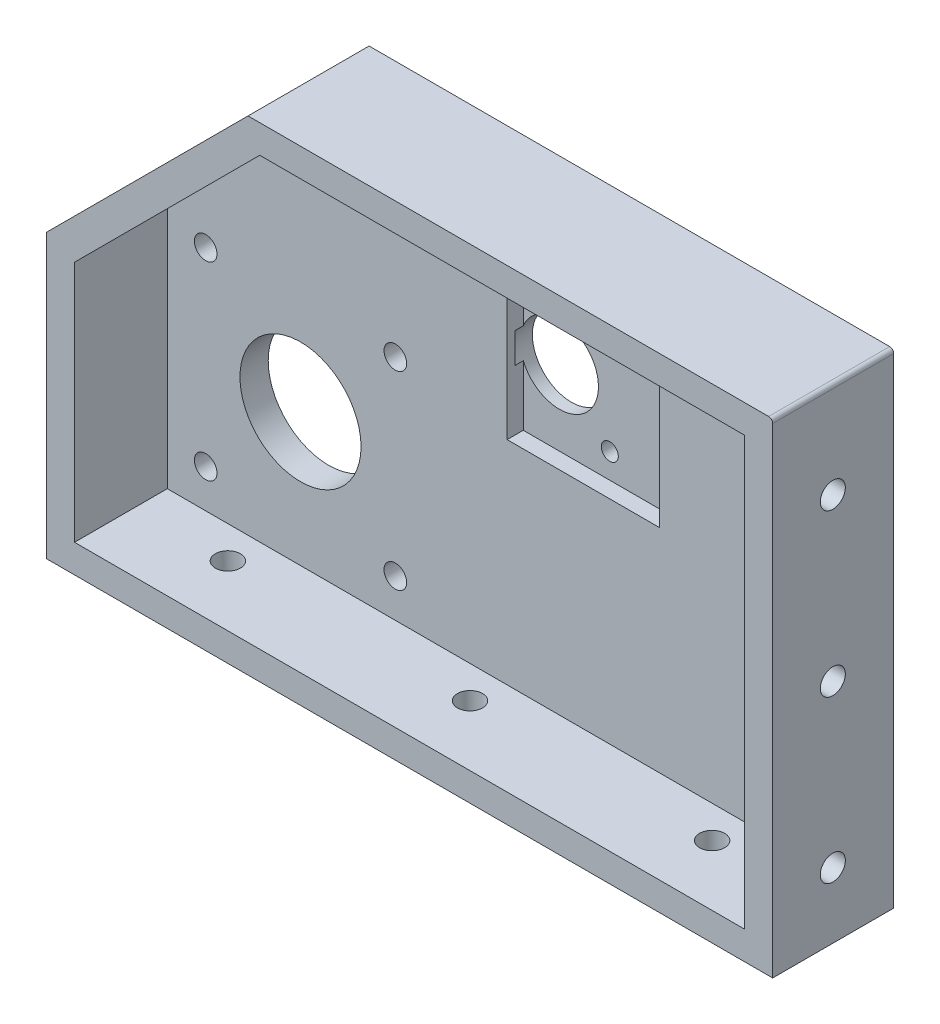
ISO-10303-21;
HEADER;
FILE_DESCRIPTION(('STEP AP214'),'2;1');
FILE_NAME('part.step','',(''),(''),'','','');
FILE_SCHEMA(('AUTOMOTIVE_DESIGN { 1 0 10303 214 1 1 1 1 }'));
ENDSEC;
DATA;
#1=APPLICATION_CONTEXT('core data for automotive mechanical design processes');
#2=APPLICATION_PROTOCOL_DEFINITION('international standard','automotive_design',2000,#1);
#3=PRODUCT_CONTEXT('',#1,'mechanical');
#4=PRODUCT('Part','Part','',(#3));
#5=PRODUCT_RELATED_PRODUCT_CATEGORY('part','',(#4));
#6=PRODUCT_DEFINITION_FORMATION('','',#4);
#7=PRODUCT_DEFINITION_CONTEXT('part definition',#1,'design');
#8=PRODUCT_DEFINITION('design','',#6,#7);
#9=PRODUCT_DEFINITION_SHAPE('','',#8);
#10=(LENGTH_UNIT() NAMED_UNIT(*) SI_UNIT(.MILLI.,.METRE.));
#11=(NAMED_UNIT(*) PLANE_ANGLE_UNIT() SI_UNIT($,.RADIAN.));
#12=(NAMED_UNIT(*) SI_UNIT($,.STERADIAN.) SOLID_ANGLE_UNIT());
#13=UNCERTAINTY_MEASURE_WITH_UNIT(LENGTH_MEASURE(1.E-05),#10,'distance_accuracy_value','');
#14=(GEOMETRIC_REPRESENTATION_CONTEXT(3) GLOBAL_UNCERTAINTY_ASSIGNED_CONTEXT((#13)) GLOBAL_UNIT_ASSIGNED_CONTEXT((#10,
#11,#12)) REPRESENTATION_CONTEXT('',''));
#15=CARTESIAN_POINT('',(0.,0.,0.));
#16=DIRECTION('',(0.,0.,1.));
#17=DIRECTION('',(1.,0.,0.));
#18=AXIS2_PLACEMENT_3D('',#15,#16,#17);
#19=CARTESIAN_POINT('',(71.4200962832074,47.0255117384244,15.0989873182288));
#20=DIRECTION('',(1.,0.,0.));
#21=DIRECTION('',(0.,1.,0.));
#22=AXIS2_PLACEMENT_3D('',#19,#20,#21);
#23=CYLINDRICAL_SURFACE('',#22,3.10668824193389);
#24=CARTESIAN_POINT('',(74.4200962832074,47.0255117384244,15.0989873182288));
#25=DIRECTION('',(-1.,0.,0.));
#26=DIRECTION('',(0.,-1.,0.));
#27=AXIS2_PLACEMENT_3D('',#24,#25,#26);
#28=CIRCLE('',#27,3.10668824193389);
#29=CARTESIAN_POINT('',(74.4200962832074,43.9188234964905,15.0989873182288));
#30=VERTEX_POINT('',#29);
#31=EDGE_CURVE('E42',#30,#30,#28,.T.);
#32=ORIENTED_EDGE('',*,*,#31,.T.);
#33=EDGE_LOOP('',(#32));
#34=FACE_BOUND('',#33,.T.);
#35=CARTESIAN_POINT('',(81.4200962832074,47.0255117384244,15.0989873182288));
#36=DIRECTION('',(1.,0.,0.));
#37=DIRECTION('',(0.,1.,0.));
#38=AXIS2_PLACEMENT_3D('',#35,#36,#37);
#39=CIRCLE('',#38,3.10668824193389);
#40=CARTESIAN_POINT('',(81.4200962832074,50.1321999803583,15.0989873182288));
#41=VERTEX_POINT('',#40);
#42=EDGE_CURVE('E11',#41,#41,#39,.T.);
#43=ORIENTED_EDGE('',*,*,#42,.T.);
#44=EDGE_LOOP('',(#43));
#45=FACE_BOUND('',#44,.T.);
#46=ADVANCED_FACE('F35',(#34,#45),#23,.F.);
#47=CARTESIAN_POINT('',(51.4200962832074,-39.2220936044638,15.));
#48=DIRECTION('',(0.,-1.,0.));
#49=DIRECTION('',(0.,0.,-1.));
#50=AXIS2_PLACEMENT_3D('',#47,#48,#49);
#51=CYLINDRICAL_SURFACE('',#50,3.09997711784959);
#52=CARTESIAN_POINT('',(51.4200962832074,-42.2220936044638,15.));
#53=DIRECTION('',(0.,1.,0.));
#54=DIRECTION('',(0.,0.,1.));
#55=AXIS2_PLACEMENT_3D('',#52,#53,#54);
#56=CIRCLE('',#55,3.09997711784959);
#57=CARTESIAN_POINT('',(51.4200962832074,-42.2220936044638,18.0999771178496));
#58=VERTEX_POINT('',#57);
#59=EDGE_CURVE('E169',#58,#58,#56,.T.);
#60=ORIENTED_EDGE('',*,*,#59,.T.);
#61=EDGE_LOOP('',(#60));
#62=FACE_BOUND('',#61,.T.);
#63=CARTESIAN_POINT('',(51.4200962832074,-49.2220936044638,15.));
#64=DIRECTION('',(0.,-1.,0.));
#65=DIRECTION('',(0.,0.,-1.));
#66=AXIS2_PLACEMENT_3D('',#63,#64,#65);
#67=CIRCLE('',#66,3.09997711784959);
#68=CARTESIAN_POINT('',(51.4200962832074,-49.2220936044638,11.9000228821504));
#69=VERTEX_POINT('',#68);
#70=EDGE_CURVE('E172',#69,#69,#67,.T.);
#71=ORIENTED_EDGE('',*,*,#70,.T.);
#72=EDGE_LOOP('',(#71));
#73=FACE_BOUND('',#72,.T.);
#74=ADVANCED_FACE('F228',(#62,#73),#51,.F.);
#75=CARTESIAN_POINT('',(-7.37865034544528,48.7779063955362,3.));
#76=DIRECTION('',(-1.,0.,0.));
#77=DIRECTION('',(0.,-1.,0.));
#78=AXIS2_PLACEMENT_3D('',#75,#76,#77);
#79=PLANE('',#78);
#80=DIRECTION('',(0.,0.,1.));
#81=VECTOR('',#80,1.);
#82=CARTESIAN_POINT('',(-7.37865034544528,25.3468501877261,-5.));
#83=LINE('',#82,#81);
#84=CARTESIAN_POINT('',(-7.37865034544528,25.3468501877261,5.));
#85=VERTEX_POINT('',#84);
#86=CARTESIAN_POINT('',(-7.37865034544528,25.3468501877261,3.));
#87=VERTEX_POINT('',#86);
#88=EDGE_CURVE('E49',#85,#87,#83,.F.);
#89=ORIENTED_EDGE('',*,*,#88,.F.);
#90=DIRECTION('',(0.,-1.,0.));
#91=VECTOR('',#90,1.);
#92=CARTESIAN_POINT('',(-7.37865034544528,48.7779063955362,5.));
#93=LINE('',#92,#91);
#94=CARTESIAN_POINT('',(-7.37865034544528,32.8287690495323,5.));
#95=VERTEX_POINT('',#94);
#96=EDGE_CURVE('E164',#95,#85,#93,.T.);
#97=ORIENTED_EDGE('',*,*,#96,.F.);
#98=DIRECTION('',(0.,0.,1.));
#99=VECTOR('',#98,1.);
#100=CARTESIAN_POINT('',(-7.37865034544528,32.8287690495323,-5.));
#101=LINE('',#100,#99);
#102=CARTESIAN_POINT('',(-7.37865034544528,32.8287690495323,3.));
#103=VERTEX_POINT('',#102);
#104=EDGE_CURVE('E153',#103,#95,#101,.T.);
#105=ORIENTED_EDGE('',*,*,#104,.F.);
#106=DIRECTION('',(0.,-1.,0.));
#107=VECTOR('',#106,1.);
#108=CARTESIAN_POINT('',(-7.37865034544528,48.7779063955362,3.));
#109=LINE('',#108,#107);
#110=CARTESIAN_POINT('',(-7.37865034544528,48.7779063955362,3.));
#111=VERTEX_POINT('',#110);
#112=EDGE_CURVE('E482',#111,#103,#109,.T.);
#113=ORIENTED_EDGE('',*,*,#112,.F.);
#114=DIRECTION('',(0.,0.,1.));
#115=VECTOR('',#114,1.);
#116=CARTESIAN_POINT('',(-7.37865034544528,48.7779063955362,3.));
#117=LINE('',#116,#115);
#118=CARTESIAN_POINT('',(-7.37865034544528,48.7779063955362,7.));
#119=VERTEX_POINT('',#118);
#120=EDGE_CURVE('E453',#111,#119,#117,.T.);
#121=ORIENTED_EDGE('',*,*,#120,.T.);
#122=DIRECTION('',(0.,-1.,0.));
#123=VECTOR('',#122,1.);
#124=CARTESIAN_POINT('',(-7.37865034544528,48.7779063955362,7.));
#125=LINE('',#124,#123);
#126=CARTESIAN_POINT('',(-7.37865034544527,10.4125304842075,7.));
#127=VERTEX_POINT('',#126);
#128=EDGE_CURVE('E57',#119,#127,#125,.T.);
#129=ORIENTED_EDGE('',*,*,#128,.T.);
#130=DIRECTION('',(0.,0.,1.));
#131=VECTOR('',#130,1.);
#132=CARTESIAN_POINT('',(-7.37865034544527,10.4125304842075,3.));
#133=LINE('',#132,#131);
#134=CARTESIAN_POINT('',(-7.37865034544527,10.4125304842075,3.));
#135=VERTEX_POINT('',#134);
#136=EDGE_CURVE('E454',#135,#127,#133,.T.);
#137=ORIENTED_EDGE('',*,*,#136,.F.);
#138=EDGE_CURVE('E465',#87,#135,#109,.T.);
#139=ORIENTED_EDGE('',*,*,#138,.F.);
#140=EDGE_LOOP('',(#89,#97,#105,#113,#121,#129,#137,#139));
#141=FACE_BOUND('',#140,.T.);
#142=ADVANCED_FACE('F167',(#141),#79,.F.);
#143=CARTESIAN_POINT('',(-35.0799037167926,-32.7220936044638,-13.));
#144=DIRECTION('',(0.,0.,1.));
#145=DIRECTION('',(1.,0.,0.));
#146=AXIS2_PLACEMENT_3D('',#143,#144,#145);
#147=CYLINDRICAL_SURFACE('',#146,2.80599900368879);
#148=CARTESIAN_POINT('',(-35.0799037167926,-32.7220936044638,0.));
#149=DIRECTION('',(0.,0.,-1.));
#150=DIRECTION('',(-1.,0.,0.));
#151=AXIS2_PLACEMENT_3D('',#148,#149,#150);
#152=CIRCLE('',#151,2.80599900368879);
#153=CARTESIAN_POINT('',(-37.8859027204814,-32.7220936044638,0.));
#154=VERTEX_POINT('',#153);
#155=EDGE_CURVE('E379',#154,#154,#152,.T.);
#156=ORIENTED_EDGE('',*,*,#155,.T.);
#157=EDGE_LOOP('',(#156));
#158=FACE_BOUND('',#157,.T.);
#159=CARTESIAN_POINT('',(-35.0799037167926,-32.7220936044638,7.));
#160=DIRECTION('',(0.,0.,1.));
#161=DIRECTION('',(1.,0.,0.));
#162=AXIS2_PLACEMENT_3D('',#159,#160,#161);
#163=CIRCLE('',#162,2.80599900368879);
#164=CARTESIAN_POINT('',(-32.2739047131038,-32.7220936044638,7.));
#165=VERTEX_POINT('',#164);
#166=EDGE_CURVE('E174',#165,#165,#163,.T.);
#167=ORIENTED_EDGE('',*,*,#166,.T.);
#168=EDGE_LOOP('',(#167));
#169=FACE_BOUND('',#168,.T.);
#170=ADVANCED_FACE('F236',(#158,#169),#147,.F.);
#171=CARTESIAN_POINT('',(-82.0799037167926,-32.7220936044638,-13.));
#172=DIRECTION('',(0.,0.,1.));
#173=DIRECTION('',(1.,0.,0.));
#174=AXIS2_PLACEMENT_3D('',#171,#172,#173);
#175=CYLINDRICAL_SURFACE('',#174,2.80599900368879);
#176=CARTESIAN_POINT('',(-82.0799037167926,-32.7220936044638,0.));
#177=DIRECTION('',(0.,0.,-1.));
#178=DIRECTION('',(-1.,0.,0.));
#179=AXIS2_PLACEMENT_3D('',#176,#177,#178);
#180=CIRCLE('',#179,2.80599900368879);
#181=CARTESIAN_POINT('',(-84.8859027204814,-32.7220936044638,0.));
#182=VERTEX_POINT('',#181);
#183=EDGE_CURVE('E373',#182,#182,#180,.T.);
#184=ORIENTED_EDGE('',*,*,#183,.T.);
#185=EDGE_LOOP('',(#184));
#186=FACE_BOUND('',#185,.T.);
#187=CARTESIAN_POINT('',(-82.0799037167926,-32.7220936044638,7.));
#188=DIRECTION('',(0.,0.,1.));
#189=DIRECTION('',(1.,0.,0.));
#190=AXIS2_PLACEMENT_3D('',#187,#188,#189);
#191=CIRCLE('',#190,2.80599900368879);
#192=CARTESIAN_POINT('',(-79.2739047131038,-32.7220936044638,7.));
#193=VERTEX_POINT('',#192);
#194=EDGE_CURVE('E376',#193,#193,#191,.T.);
#195=ORIENTED_EDGE('',*,*,#194,.T.);
#196=EDGE_LOOP('',(#195));
#197=FACE_BOUND('',#196,.T.);
#198=ADVANCED_FACE('F242',(#186,#197),#175,.F.);
#199=CARTESIAN_POINT('',(80.4200962832074,69.7779063955362,30.));
#200=DIRECTION('',(0.,0.,-1.));
#201=DIRECTION('',(-1.,0.,0.));
#202=AXIS2_PLACEMENT_3D('',#199,#200,#201);
#203=PLANE('',#202);
#204=DIRECTION('',(0.,1.,0.));
#205=VECTOR('',#204,1.);
#206=CARTESIAN_POINT('',(81.4200962832074,69.7779063955362,30.));
#207=LINE('',#206,#205);
#208=CARTESIAN_POINT('',(81.4200962832074,-49.2220936044638,30.));
#209=VERTEX_POINT('',#208);
#210=CARTESIAN_POINT('',(81.4200962832074,69.7779063955362,30.));
#211=VERTEX_POINT('',#210);
#212=EDGE_CURVE('E328',#209,#211,#207,.T.);
#213=ORIENTED_EDGE('',*,*,#212,.T.);
#214=CARTESIAN_POINT('',(80.4200962832074,69.7779063955362,30.));
#215=DIRECTION('',(0.,0.,1.));
#216=DIRECTION('',(-1.,0.,0.));
#217=AXIS2_PLACEMENT_3D('',#214,#215,#216);
#218=CIRCLE('',#217,1.00000000000001);
#219=CARTESIAN_POINT('',(80.4200962832074,70.7779063955362,30.));
#220=VERTEX_POINT('',#219);
#221=EDGE_CURVE('E331',#211,#220,#218,.T.);
#222=ORIENTED_EDGE('',*,*,#221,.T.);
#223=DIRECTION('',(-1.,0.,0.));
#224=VECTOR('',#223,1.);
#225=CARTESIAN_POINT('',(-48.5799037167926,70.7779063955362,30.));
#226=LINE('',#225,#224);
#227=CARTESIAN_POINT('',(-48.5799037167926,70.7779063955362,30.));
#228=VERTEX_POINT('',#227);
#229=EDGE_CURVE('E334',#220,#228,#226,.T.);
#230=ORIENTED_EDGE('',*,*,#229,.T.);
#231=DIRECTION('',(-0.707106781186547,-0.707106781186547,0.));
#232=VECTOR('',#231,1.);
#233=CARTESIAN_POINT('',(-48.5799037167926,70.7779063955362,30.));
#234=LINE('',#233,#232);
#235=CARTESIAN_POINT('',(-98.5799037167926,20.7779063955362,30.));
#236=VERTEX_POINT('',#235);
#237=EDGE_CURVE('E336',#228,#236,#234,.T.);
#238=ORIENTED_EDGE('',*,*,#237,.T.);
#239=DIRECTION('',(0.,-1.,0.));
#240=VECTOR('',#239,1.);
#241=CARTESIAN_POINT('',(-98.5799037167926,20.7779063955362,30.));
#242=LINE('',#241,#240);
#243=CARTESIAN_POINT('',(-98.5799037167926,-49.2220936044638,30.));
#244=VERTEX_POINT('',#243);
#245=EDGE_CURVE('E338',#236,#244,#242,.T.);
#246=ORIENTED_EDGE('',*,*,#245,.T.);
#247=DIRECTION('',(1.,0.,0.));
#248=VECTOR('',#247,1.);
#249=CARTESIAN_POINT('',(-98.5799037167926,-49.2220936044638,30.));
#250=LINE('',#249,#248);
#251=EDGE_CURVE('E340',#244,#209,#250,.T.);
#252=ORIENTED_EDGE('',*,*,#251,.T.);
#253=EDGE_LOOP('',(#213,#222,#230,#238,#246,#252));
#254=FACE_BOUND('',#253,.T.);
#255=DIRECTION('',(0.,1.,0.));
#256=VECTOR('',#255,1.);
#257=CARTESIAN_POINT('',(74.4200962832074,69.7779063955362,30.));
#258=LINE('',#257,#256);
#259=CARTESIAN_POINT('',(74.4200962832074,-42.2220936044638,30.));
#260=VERTEX_POINT('',#259);
#261=CARTESIAN_POINT('',(74.4200962832074,63.7779063955362,30.));
#262=VERTEX_POINT('',#261);
#263=EDGE_CURVE('E317',#260,#262,#258,.T.);
#264=ORIENTED_EDGE('',*,*,#263,.F.);
#265=DIRECTION('',(1.,0.,0.));
#266=VECTOR('',#265,1.);
#267=CARTESIAN_POINT('',(80.4200962832074,-42.2220936044638,30.));
#268=LINE('',#267,#266);
#269=CARTESIAN_POINT('',(-91.5799037167926,-42.2220936044638,30.));
#270=VERTEX_POINT('',#269);
#271=EDGE_CURVE('E326',#270,#260,#268,.T.);
#272=ORIENTED_EDGE('',*,*,#271,.F.);
#273=DIRECTION('',(0.,-1.,0.));
#274=VECTOR('',#273,1.);
#275=CARTESIAN_POINT('',(-91.5799037167926,69.7779063955362,30.));
#276=LINE('',#275,#274);
#277=CARTESIAN_POINT('',(-91.5799037167926,17.8784114589246,30.));
#278=VERTEX_POINT('',#277);
#279=EDGE_CURVE('E323',#278,#270,#276,.T.);
#280=ORIENTED_EDGE('',*,*,#279,.F.);
#281=DIRECTION('',(-0.707106781186548,-0.707106781186548,0.));
#282=VECTOR('',#281,1.);
#283=CARTESIAN_POINT('',(20.3698437515132,129.82815892723,30.));
#284=LINE('',#283,#282);
#285=CARTESIAN_POINT('',(-45.680408780181,63.7779063955362,30.));
#286=VERTEX_POINT('',#285);
#287=EDGE_CURVE('E321',#286,#278,#284,.T.);
#288=ORIENTED_EDGE('',*,*,#287,.F.);
#289=DIRECTION('',(-1.,0.,0.));
#290=VECTOR('',#289,1.);
#291=CARTESIAN_POINT('',(80.4200962832074,63.7779063955362,30.));
#292=LINE('',#291,#290);
#293=EDGE_CURVE('E319',#262,#286,#292,.T.);
#294=ORIENTED_EDGE('',*,*,#293,.F.);
#295=EDGE_LOOP('',(#264,#272,#280,#288,#294));
#296=FACE_BOUND('',#295,.T.);
#297=ADVANCED_FACE('F246',(#254,#296),#203,.F.);
#298=CARTESIAN_POINT('',(81.4200962832074,69.7779063955362,30.));
#299=DIRECTION('',(-1.,0.,0.));
#300=DIRECTION('',(0.,-1.,0.));
#301=AXIS2_PLACEMENT_3D('',#298,#299,#300);
#302=PLANE('',#301);
#303=CARTESIAN_POINT('',(81.4200962832074,7.02551173842437,15.0989873182288));
#304=DIRECTION('',(1.,0.,0.));
#305=DIRECTION('',(0.,1.,0.));
#306=AXIS2_PLACEMENT_3D('',#303,#304,#305);
#307=CIRCLE('',#306,3.10668824193389);
#308=CARTESIAN_POINT('',(81.4200962832074,10.1321999803583,15.0989873182288));
#309=VERTEX_POINT('',#308);
#310=EDGE_CURVE('E504',#309,#309,#307,.T.);
#311=ORIENTED_EDGE('',*,*,#310,.F.);
#312=EDGE_LOOP('',(#311));
#313=FACE_BOUND('',#312,.T.);
#314=CARTESIAN_POINT('',(81.4200962832074,-32.9744882615756,15.0989873182288));
#315=DIRECTION('',(1.,0.,0.));
#316=DIRECTION('',(0.,1.,0.));
#317=AXIS2_PLACEMENT_3D('',#314,#315,#316);
#318=CIRCLE('',#317,3.10668824193389);
#319=CARTESIAN_POINT('',(81.4200962832074,-29.8678000196417,15.0989873182288));
#320=VERTEX_POINT('',#319);
#321=EDGE_CURVE('E202',#320,#320,#318,.T.);
#322=ORIENTED_EDGE('',*,*,#321,.F.);
#323=EDGE_LOOP('',(#322));
#324=FACE_BOUND('',#323,.T.);
#325=DIRECTION('',(0.,1.,0.));
#326=VECTOR('',#325,1.);
#327=CARTESIAN_POINT('',(81.4200962832074,69.7779063955362,0.));
#328=LINE('',#327,#326);
#329=CARTESIAN_POINT('',(81.4200962832074,-49.2220936044638,0.));
#330=VERTEX_POINT('',#329);
#331=CARTESIAN_POINT('',(81.4200962832074,69.7779063955362,0.));
#332=VERTEX_POINT('',#331);
#333=EDGE_CURVE('E343',#330,#332,#328,.T.);
#334=ORIENTED_EDGE('',*,*,#333,.T.);
#335=DIRECTION('',(0.,0.,-1.));
#336=VECTOR('',#335,1.);
#337=CARTESIAN_POINT('',(81.4200962832074,69.7779063955362,30.));
#338=LINE('',#337,#336);
#339=EDGE_CURVE('E370',#211,#332,#338,.T.);
#340=ORIENTED_EDGE('',*,*,#339,.F.);
#341=ORIENTED_EDGE('',*,*,#212,.F.);
#342=DIRECTION('',(0.,0.,-1.));
#343=VECTOR('',#342,1.);
#344=CARTESIAN_POINT('',(81.4200962832074,-49.2220936044638,30.));
#345=LINE('',#344,#343);
#346=EDGE_CURVE('E342',#209,#330,#345,.T.);
#347=ORIENTED_EDGE('',*,*,#346,.T.);
#348=EDGE_LOOP('',(#334,#340,#341,#347));
#349=FACE_BOUND('',#348,.T.);
#350=ORIENTED_EDGE('',*,*,#42,.F.);
#351=EDGE_LOOP('',(#350));
#352=FACE_BOUND('',#351,.T.);
#353=ADVANCED_FACE('F248',(#313,#324,#349,#352),#302,.F.);
#354=CARTESIAN_POINT('',(80.4200962832074,69.7779063955362,30.));
#355=DIRECTION('',(0.,0.,-1.));
#356=DIRECTION('',(-1.,0.,0.));
#357=AXIS2_PLACEMENT_3D('',#354,#355,#356);
#358=CYLINDRICAL_SURFACE('',#357,1.00000000000001);
#359=CARTESIAN_POINT('',(80.4200962832074,69.7779063955362,0.));
#360=DIRECTION('',(0.,0.,1.));
#361=DIRECTION('',(-1.,0.,0.));
#362=AXIS2_PLACEMENT_3D('',#359,#360,#361);
#363=CIRCLE('',#362,1.00000000000001);
#364=CARTESIAN_POINT('',(80.4200962832074,70.7779063955362,0.));
#365=VERTEX_POINT('',#364);
#366=EDGE_CURVE('E346',#332,#365,#363,.T.);
#367=ORIENTED_EDGE('',*,*,#366,.T.);
#368=DIRECTION('',(0.,0.,-1.));
#369=VECTOR('',#368,1.);
#370=CARTESIAN_POINT('',(80.4200962832074,70.7779063955362,30.));
#371=LINE('',#370,#369);
#372=EDGE_CURVE('E367',#220,#365,#371,.T.);
#373=ORIENTED_EDGE('',*,*,#372,.F.);
#374=ORIENTED_EDGE('',*,*,#221,.F.);
#375=ORIENTED_EDGE('',*,*,#339,.T.);
#376=EDGE_LOOP('',(#367,#373,#374,#375));
#377=FACE_BOUND('',#376,.T.);
#378=ADVANCED_FACE('F251',(#377),#358,.T.);
#379=CARTESIAN_POINT('',(-48.5799037167926,70.7779063955362,30.));
#380=DIRECTION('',(0.,-1.,0.));
#381=DIRECTION('',(1.,0.,0.));
#382=AXIS2_PLACEMENT_3D('',#379,#380,#381);
#383=PLANE('',#382);
#384=DIRECTION('',(-1.,0.,0.));
#385=VECTOR('',#384,1.);
#386=CARTESIAN_POINT('',(-48.5799037167926,70.7779063955362,0.));
#387=LINE('',#386,#385);
#388=CARTESIAN_POINT('',(-48.5799037167926,70.7779063955362,0.));
#389=VERTEX_POINT('',#388);
#390=EDGE_CURVE('E349',#365,#389,#387,.T.);
#391=ORIENTED_EDGE('',*,*,#390,.T.);
#392=DIRECTION('',(0.,0.,-1.));
#393=VECTOR('',#392,1.);
#394=CARTESIAN_POINT('',(-48.5799037167926,70.7779063955362,30.));
#395=LINE('',#394,#393);
#396=EDGE_CURVE('E364',#228,#389,#395,.T.);
#397=ORIENTED_EDGE('',*,*,#396,.F.);
#398=ORIENTED_EDGE('',*,*,#229,.F.);
#399=ORIENTED_EDGE('',*,*,#372,.T.);
#400=EDGE_LOOP('',(#391,#397,#398,#399));
#401=FACE_BOUND('',#400,.T.);
#402=ADVANCED_FACE('F255',(#401),#383,.F.);
#403=CARTESIAN_POINT('',(-48.5799037167926,70.7779063955362,30.));
#404=DIRECTION('',(0.707106781186547,-0.707106781186547,0.));
#405=DIRECTION('',(0.707106781186548,0.707106781186548,0.));
#406=AXIS2_PLACEMENT_3D('',#403,#404,#405);
#407=PLANE('',#406);
#408=DIRECTION('',(-0.707106781186547,-0.707106781186547,0.));
#409=VECTOR('',#408,1.);
#410=CARTESIAN_POINT('',(-48.5799037167926,70.7779063955362,0.));
#411=LINE('',#410,#409);
#412=CARTESIAN_POINT('',(-98.5799037167926,20.7779063955362,0.));
#413=VERTEX_POINT('',#412);
#414=EDGE_CURVE('E351',#389,#413,#411,.T.);
#415=ORIENTED_EDGE('',*,*,#414,.T.);
#416=DIRECTION('',(0.,0.,-1.));
#417=VECTOR('',#416,1.);
#418=CARTESIAN_POINT('',(-98.5799037167926,20.7779063955362,30.));
#419=LINE('',#418,#417);
#420=EDGE_CURVE('E361',#236,#413,#419,.T.);
#421=ORIENTED_EDGE('',*,*,#420,.F.);
#422=ORIENTED_EDGE('',*,*,#237,.F.);
#423=ORIENTED_EDGE('',*,*,#396,.T.);
#424=EDGE_LOOP('',(#415,#421,#422,#423));
#425=FACE_BOUND('',#424,.T.);
#426=ADVANCED_FACE('F259',(#425),#407,.F.);
#427=CARTESIAN_POINT('',(-98.5799037167926,20.7779063955362,30.));
#428=DIRECTION('',(1.,0.,0.));
#429=DIRECTION('',(0.,0.,-1.));
#430=AXIS2_PLACEMENT_3D('',#427,#428,#429);
#431=PLANE('',#430);
#432=DIRECTION('',(0.,-1.,0.));
#433=VECTOR('',#432,1.);
#434=CARTESIAN_POINT('',(-98.5799037167926,20.7779063955362,0.));
#435=LINE('',#434,#433);
#436=CARTESIAN_POINT('',(-98.5799037167926,-49.2220936044638,0.));
#437=VERTEX_POINT('',#436);
#438=EDGE_CURVE('E353',#413,#437,#435,.T.);
#439=ORIENTED_EDGE('',*,*,#438,.T.);
#440=DIRECTION('',(0.,0.,-1.));
#441=VECTOR('',#440,1.);
#442=CARTESIAN_POINT('',(-98.5799037167926,-49.2220936044638,30.));
#443=LINE('',#442,#441);
#444=EDGE_CURVE('E358',#244,#437,#443,.T.);
#445=ORIENTED_EDGE('',*,*,#444,.F.);
#446=ORIENTED_EDGE('',*,*,#245,.F.);
#447=ORIENTED_EDGE('',*,*,#420,.T.);
#448=EDGE_LOOP('',(#439,#445,#446,#447));
#449=FACE_BOUND('',#448,.T.);
#450=ADVANCED_FACE('F263',(#449),#431,.F.);
#451=CARTESIAN_POINT('',(-98.5799037167926,-49.2220936044638,30.));
#452=DIRECTION('',(0.,1.,0.));
#453=DIRECTION('',(0.,0.,1.));
#454=AXIS2_PLACEMENT_3D('',#451,#452,#453);
#455=PLANE('',#454);
#456=CARTESIAN_POINT('',(-8.57990371679264,-49.2220936044638,15.));
#457=DIRECTION('',(0.,-1.,0.));
#458=DIRECTION('',(0.,0.,-1.));
#459=AXIS2_PLACEMENT_3D('',#456,#457,#458);
#460=CIRCLE('',#459,3.09997711784959);
#461=CARTESIAN_POINT('',(-8.57990371679264,-49.2220936044638,11.9000228821504));
#462=VERTEX_POINT('',#461);
#463=EDGE_CURVE('E497',#462,#462,#460,.T.);
#464=ORIENTED_EDGE('',*,*,#463,.F.);
#465=EDGE_LOOP('',(#464));
#466=FACE_BOUND('',#465,.T.);
#467=CARTESIAN_POINT('',(-68.5799037167926,-49.2220936044638,15.));
#468=DIRECTION('',(0.,-1.,0.));
#469=DIRECTION('',(0.,0.,-1.));
#470=AXIS2_PLACEMENT_3D('',#467,#468,#469);
#471=CIRCLE('',#470,3.09997711784959);
#472=CARTESIAN_POINT('',(-68.5799037167926,-49.2220936044638,11.9000228821504));
#473=VERTEX_POINT('',#472);
#474=EDGE_CURVE('E195',#473,#473,#471,.T.);
#475=ORIENTED_EDGE('',*,*,#474,.F.);
#476=EDGE_LOOP('',(#475));
#477=FACE_BOUND('',#476,.T.);
#478=DIRECTION('',(1.,0.,0.));
#479=VECTOR('',#478,1.);
#480=CARTESIAN_POINT('',(-98.5799037167926,-49.2220936044638,0.));
#481=LINE('',#480,#479);
#482=EDGE_CURVE('E332',#437,#330,#481,.T.);
#483=ORIENTED_EDGE('',*,*,#482,.T.);
#484=ORIENTED_EDGE('',*,*,#346,.F.);
#485=ORIENTED_EDGE('',*,*,#251,.F.);
#486=ORIENTED_EDGE('',*,*,#444,.T.);
#487=EDGE_LOOP('',(#483,#484,#485,#486));
#488=FACE_BOUND('',#487,.T.);
#489=ORIENTED_EDGE('',*,*,#70,.F.);
#490=EDGE_LOOP('',(#489));
#491=FACE_BOUND('',#490,.T.);
#492=ADVANCED_FACE('F221',(#466,#477,#488,#491),#455,.F.);
#493=CARTESIAN_POINT('',(80.4200962832074,69.7779063955362,0.));
#494=DIRECTION('',(0.,0.,-1.));
#495=DIRECTION('',(-1.,0.,0.));
#496=AXIS2_PLACEMENT_3D('',#493,#494,#495);
#497=PLANE('',#496);
#498=CARTESIAN_POINT('',(14.059438540444,16.5878096186292,0.));
#499=DIRECTION('',(0.,0.,-1.));
#500=DIRECTION('',(-1.,0.,0.));
#501=AXIS2_PLACEMENT_3D('',#498,#499,#500);
#502=CIRCLE('',#501,2.10938283785416);
#503=CARTESIAN_POINT('',(11.9500557025899,16.5878096186292,0.));
#504=VERTEX_POINT('',#503);
#505=EDGE_CURVE('E185',#504,#504,#502,.F.);
#506=ORIENTED_EDGE('',*,*,#505,.T.);
#507=EDGE_LOOP('',(#506));
#508=FACE_BOUND('',#507,.T.);
#509=CARTESIAN_POINT('',(-10.940561459556,41.5878096186292,0.));
#510=DIRECTION('',(0.,0.,-1.));
#511=DIRECTION('',(-1.,0.,0.));
#512=AXIS2_PLACEMENT_3D('',#509,#510,#511);
#513=CIRCLE('',#512,2.10938283785416);
#514=CARTESIAN_POINT('',(-13.0499442974101,41.5878096186292,0.));
#515=VERTEX_POINT('',#514);
#516=EDGE_CURVE('E181',#515,#515,#513,.F.);
#517=ORIENTED_EDGE('',*,*,#516,.T.);
#518=EDGE_LOOP('',(#517));
#519=FACE_BOUND('',#518,.T.);
#520=CARTESIAN_POINT('',(-10.940561459556,16.5878096186292,0.));
#521=DIRECTION('',(0.,0.,-1.));
#522=DIRECTION('',(-1.,0.,0.));
#523=AXIS2_PLACEMENT_3D('',#520,#521,#522);
#524=CIRCLE('',#523,2.10938283785416);
#525=CARTESIAN_POINT('',(-13.0499442974101,16.5878096186292,0.));
#526=VERTEX_POINT('',#525);
#527=EDGE_CURVE('E187',#526,#526,#524,.F.);
#528=ORIENTED_EDGE('',*,*,#527,.T.);
#529=EDGE_LOOP('',(#528));
#530=FACE_BOUND('',#529,.T.);
#531=CARTESIAN_POINT('',(14.059438540444,41.5878096186292,0.));
#532=DIRECTION('',(0.,0.,-1.));
#533=DIRECTION('',(-1.,0.,0.));
#534=AXIS2_PLACEMENT_3D('',#531,#532,#533);
#535=CIRCLE('',#534,2.10938283785416);
#536=CARTESIAN_POINT('',(11.9500557025899,41.5878096186292,0.));
#537=VERTEX_POINT('',#536);
#538=EDGE_CURVE('E165',#537,#537,#535,.F.);
#539=ORIENTED_EDGE('',*,*,#538,.T.);
#540=EDGE_LOOP('',(#539));
#541=FACE_BOUND('',#540,.T.);
#542=CARTESIAN_POINT('',(1.55943854044403,29.0878096186292,0.));
#543=DIRECTION('',(0.,0.,-1.));
#544=DIRECTION('',(-1.,0.,0.));
#545=AXIS2_PLACEMENT_3D('',#542,#543,#544);
#546=CIRCLE('',#545,9.68938648190488);
#547=CARTESIAN_POINT('',(-8.12994794146084,29.0878096186292,0.));
#548=VERTEX_POINT('',#547);
#549=EDGE_CURVE('E473',#548,#548,#546,.F.);
#550=ORIENTED_EDGE('',*,*,#549,.T.);
#551=EDGE_LOOP('',(#550));
#552=FACE_BOUND('',#551,.T.);
#553=CARTESIAN_POINT('',(-35.0799037167926,14.2779063955362,0.));
#554=DIRECTION('',(0.,0.,-1.));
#555=DIRECTION('',(-1.,0.,0.));
#556=AXIS2_PLACEMENT_3D('',#553,#554,#555);
#557=CIRCLE('',#556,2.80599900368879);
#558=CARTESIAN_POINT('',(-37.8859027204814,14.2779063955362,0.));
#559=VERTEX_POINT('',#558);
#560=EDGE_CURVE('E450',#559,#559,#557,.T.);
#561=ORIENTED_EDGE('',*,*,#560,.F.);
#562=EDGE_LOOP('',(#561));
#563=FACE_BOUND('',#562,.T.);
#564=CARTESIAN_POINT('',(-82.0799037167926,14.2779063955362,0.));
#565=DIRECTION('',(0.,0.,-1.));
#566=DIRECTION('',(-1.,0.,0.));
#567=AXIS2_PLACEMENT_3D('',#564,#565,#566);
#568=CIRCLE('',#567,2.80599900368879);
#569=CARTESIAN_POINT('',(-84.8859027204814,14.2779063955362,0.));
#570=VERTEX_POINT('',#569);
#571=EDGE_CURVE('E439',#570,#570,#568,.T.);
#572=ORIENTED_EDGE('',*,*,#571,.F.);
#573=EDGE_LOOP('',(#572));
#574=FACE_BOUND('',#573,.T.);
#575=CARTESIAN_POINT('',(-58.5799037167926,-9.22209360446376,0.));
#576=DIRECTION('',(0.,0.,-1.));
#577=DIRECTION('',(-1.,0.,0.));
#578=AXIS2_PLACEMENT_3D('',#575,#576,#577);
#579=CIRCLE('',#578,15.);
#580=CARTESIAN_POINT('',(-73.5799037167926,-9.22209360446376,0.));
#581=VERTEX_POINT('',#580);
#582=EDGE_CURVE('E433',#581,#581,#579,.T.);
#583=ORIENTED_EDGE('',*,*,#582,.F.);
#584=EDGE_LOOP('',(#583));
#585=FACE_BOUND('',#584,.T.);
#586=ORIENTED_EDGE('',*,*,#333,.F.);
#587=ORIENTED_EDGE('',*,*,#482,.F.);
#588=ORIENTED_EDGE('',*,*,#438,.F.);
#589=ORIENTED_EDGE('',*,*,#414,.F.);
#590=ORIENTED_EDGE('',*,*,#390,.F.);
#591=ORIENTED_EDGE('',*,*,#366,.F.);
#592=EDGE_LOOP('',(#586,#587,#588,#589,#590,#591));
#593=FACE_BOUND('',#592,.T.);
#594=ORIENTED_EDGE('',*,*,#183,.F.);
#595=EDGE_LOOP('',(#594));
#596=FACE_BOUND('',#595,.T.);
#597=ORIENTED_EDGE('',*,*,#155,.F.);
#598=EDGE_LOOP('',(#597));
#599=FACE_BOUND('',#598,.T.);
#600=ADVANCED_FACE('F211',(#508,#519,#530,#541,#552,#563,#574,#585,#593,#596,#599),#497,.T.);
#601=CARTESIAN_POINT('',(74.4200962832074,69.7779063955362,30.));
#602=DIRECTION('',(-1.,0.,0.));
#603=DIRECTION('',(0.,-1.,0.));
#604=AXIS2_PLACEMENT_3D('',#601,#602,#603);
#605=PLANE('',#604);
#606=CARTESIAN_POINT('',(74.4200962832074,7.02551173842437,15.0989873182288));
#607=DIRECTION('',(-1.,0.,0.));
#608=DIRECTION('',(0.,-1.,0.));
#609=AXIS2_PLACEMENT_3D('',#606,#607,#608);
#610=CIRCLE('',#609,3.10668824193389);
#611=CARTESIAN_POINT('',(74.4200962832074,3.91882349649048,15.0989873182288));
#612=VERTEX_POINT('',#611);
#613=EDGE_CURVE('E507',#612,#612,#610,.T.);
#614=ORIENTED_EDGE('',*,*,#613,.F.);
#615=EDGE_LOOP('',(#614));
#616=FACE_BOUND('',#615,.T.);
#617=CARTESIAN_POINT('',(74.4200962832074,-32.9744882615756,15.0989873182288));
#618=DIRECTION('',(-1.,0.,0.));
#619=DIRECTION('',(0.,-1.,0.));
#620=AXIS2_PLACEMENT_3D('',#617,#618,#619);
#621=CIRCLE('',#620,3.10668824193389);
#622=CARTESIAN_POINT('',(74.4200962832074,-36.0811765035095,15.0989873182288));
#623=VERTEX_POINT('',#622);
#624=EDGE_CURVE('E199',#623,#623,#621,.T.);
#625=ORIENTED_EDGE('',*,*,#624,.F.);
#626=EDGE_LOOP('',(#625));
#627=FACE_BOUND('',#626,.T.);
#628=DIRECTION('',(0.,1.,0.));
#629=VECTOR('',#628,1.);
#630=CARTESIAN_POINT('',(74.4200962832074,69.7779063955362,7.));
#631=LINE('',#630,#629);
#632=CARTESIAN_POINT('',(74.4200962832074,-42.2220936044638,7.));
#633=VERTEX_POINT('',#632);
#634=CARTESIAN_POINT('',(74.4200962832074,63.7779063955362,7.));
#635=VERTEX_POINT('',#634);
#636=EDGE_CURVE('E307',#633,#635,#631,.T.);
#637=ORIENTED_EDGE('',*,*,#636,.F.);
#638=DIRECTION('',(0.,0.,-1.));
#639=VECTOR('',#638,1.);
#640=CARTESIAN_POINT('',(74.4200962832074,-42.2220936044638,30.));
#641=LINE('',#640,#639);
#642=EDGE_CURVE('E315',#260,#633,#641,.T.);
#643=ORIENTED_EDGE('',*,*,#642,.F.);
#644=ORIENTED_EDGE('',*,*,#263,.T.);
#645=DIRECTION('',(0.,0.,-1.));
#646=VECTOR('',#645,1.);
#647=CARTESIAN_POINT('',(74.4200962832074,63.7779063955362,30.));
#648=LINE('',#647,#646);
#649=EDGE_CURVE('E347',#262,#635,#648,.T.);
#650=ORIENTED_EDGE('',*,*,#649,.T.);
#651=EDGE_LOOP('',(#637,#643,#644,#650));
#652=FACE_BOUND('',#651,.T.);
#653=ORIENTED_EDGE('',*,*,#31,.F.);
#654=EDGE_LOOP('',(#653));
#655=FACE_BOUND('',#654,.T.);
#656=ADVANCED_FACE('F208',(#616,#627,#652,#655),#605,.T.);
#657=CARTESIAN_POINT('',(-48.5799037167926,63.7779063955362,30.));
#658=DIRECTION('',(0.,-1.,0.));
#659=DIRECTION('',(1.,0.,0.));
#660=AXIS2_PLACEMENT_3D('',#657,#658,#659);
#661=PLANE('',#660);
#662=DIRECTION('',(-1.,0.,0.));
#663=VECTOR('',#662,1.);
#664=CARTESIAN_POINT('',(80.4200962832074,63.7779063955362,7.));
#665=LINE('',#664,#663);
#666=CARTESIAN_POINT('',(-45.680408780181,63.7779063955362,7.));
#667=VERTEX_POINT('',#666);
#668=EDGE_CURVE('E303',#635,#667,#665,.T.);
#669=ORIENTED_EDGE('',*,*,#668,.F.);
#670=ORIENTED_EDGE('',*,*,#649,.F.);
#671=ORIENTED_EDGE('',*,*,#293,.T.);
#672=DIRECTION('',(0.,0.,-1.));
#673=VECTOR('',#672,1.);
#674=CARTESIAN_POINT('',(-45.680408780181,63.7779063955362,30.));
#675=LINE('',#674,#673);
#676=EDGE_CURVE('E296',#286,#667,#675,.T.);
#677=ORIENTED_EDGE('',*,*,#676,.T.);
#678=EDGE_LOOP('',(#669,#670,#671,#677));
#679=FACE_BOUND('',#678,.T.);
#680=ADVANCED_FACE('F210',(#679),#661,.T.);
#681=CARTESIAN_POINT('',(-43.6301562484868,65.8281589272304,30.));
#682=DIRECTION('',(0.707106781186547,-0.707106781186547,0.));
#683=DIRECTION('',(0.707106781186548,0.707106781186548,0.));
#684=AXIS2_PLACEMENT_3D('',#681,#682,#683);
#685=PLANE('',#684);
#686=DIRECTION('',(-0.707106781186548,-0.707106781186548,0.));
#687=VECTOR('',#686,1.);
#688=CARTESIAN_POINT('',(20.3698437515132,129.82815892723,7.));
#689=LINE('',#688,#687);
#690=CARTESIAN_POINT('',(-91.5799037167926,17.8784114589246,7.));
#691=VERTEX_POINT('',#690);
#692=EDGE_CURVE('E294',#667,#691,#689,.T.);
#693=ORIENTED_EDGE('',*,*,#692,.F.);
#694=ORIENTED_EDGE('',*,*,#676,.F.);
#695=ORIENTED_EDGE('',*,*,#287,.T.);
#696=DIRECTION('',(0.,0.,-1.));
#697=VECTOR('',#696,1.);
#698=CARTESIAN_POINT('',(-91.5799037167926,17.8784114589246,30.));
#699=LINE('',#698,#697);
#700=EDGE_CURVE('E299',#278,#691,#699,.T.);
#701=ORIENTED_EDGE('',*,*,#700,.T.);
#702=EDGE_LOOP('',(#693,#694,#695,#701));
#703=FACE_BOUND('',#702,.T.);
#704=ADVANCED_FACE('F218',(#703),#685,.T.);
#705=CARTESIAN_POINT('',(-91.5799037167926,20.7779063955362,30.));
#706=DIRECTION('',(1.,0.,0.));
#707=DIRECTION('',(0.,0.,-1.));
#708=AXIS2_PLACEMENT_3D('',#705,#706,#707);
#709=PLANE('',#708);
#710=DIRECTION('',(0.,-1.,0.));
#711=VECTOR('',#710,1.);
#712=CARTESIAN_POINT('',(-91.5799037167926,69.7779063955362,7.));
#713=LINE('',#712,#711);
#714=CARTESIAN_POINT('',(-91.5799037167926,-42.2220936044638,7.));
#715=VERTEX_POINT('',#714);
#716=EDGE_CURVE('E302',#691,#715,#713,.T.);
#717=ORIENTED_EDGE('',*,*,#716,.F.);
#718=ORIENTED_EDGE('',*,*,#700,.F.);
#719=ORIENTED_EDGE('',*,*,#279,.T.);
#720=DIRECTION('',(0.,0.,-1.));
#721=VECTOR('',#720,1.);
#722=CARTESIAN_POINT('',(-91.5799037167926,-42.2220936044638,30.));
#723=LINE('',#722,#721);
#724=EDGE_CURVE('E311',#270,#715,#723,.T.);
#725=ORIENTED_EDGE('',*,*,#724,.T.);
#726=EDGE_LOOP('',(#717,#718,#719,#725));
#727=FACE_BOUND('',#726,.T.);
#728=ADVANCED_FACE('F282',(#727),#709,.T.);
#729=CARTESIAN_POINT('',(-98.5799037167926,-42.2220936044638,30.));
#730=DIRECTION('',(0.,1.,0.));
#731=DIRECTION('',(0.,0.,1.));
#732=AXIS2_PLACEMENT_3D('',#729,#730,#731);
#733=PLANE('',#732);
#734=CARTESIAN_POINT('',(-8.57990371679264,-42.2220936044638,15.));
#735=DIRECTION('',(0.,1.,0.));
#736=DIRECTION('',(0.,0.,1.));
#737=AXIS2_PLACEMENT_3D('',#734,#735,#736);
#738=CIRCLE('',#737,3.09997711784959);
#739=CARTESIAN_POINT('',(-8.57990371679264,-42.2220936044638,18.0999771178496));
#740=VERTEX_POINT('',#739);
#741=EDGE_CURVE('E201',#740,#740,#738,.T.);
#742=ORIENTED_EDGE('',*,*,#741,.F.);
#743=EDGE_LOOP('',(#742));
#744=FACE_BOUND('',#743,.T.);
#745=CARTESIAN_POINT('',(-68.5799037167926,-42.2220936044638,15.));
#746=DIRECTION('',(0.,1.,0.));
#747=DIRECTION('',(0.,0.,1.));
#748=AXIS2_PLACEMENT_3D('',#745,#746,#747);
#749=CIRCLE('',#748,3.09997711784959);
#750=CARTESIAN_POINT('',(-68.5799037167926,-42.2220936044638,18.0999771178496));
#751=VERTEX_POINT('',#750);
#752=EDGE_CURVE('E192',#751,#751,#749,.T.);
#753=ORIENTED_EDGE('',*,*,#752,.F.);
#754=EDGE_LOOP('',(#753));
#755=FACE_BOUND('',#754,.T.);
#756=DIRECTION('',(1.,0.,0.));
#757=VECTOR('',#756,1.);
#758=CARTESIAN_POINT('',(80.4200962832074,-42.2220936044638,7.));
#759=LINE('',#758,#757);
#760=EDGE_CURVE('E305',#715,#633,#759,.T.);
#761=ORIENTED_EDGE('',*,*,#760,.F.);
#762=ORIENTED_EDGE('',*,*,#724,.F.);
#763=ORIENTED_EDGE('',*,*,#271,.T.);
#764=ORIENTED_EDGE('',*,*,#642,.T.);
#765=EDGE_LOOP('',(#761,#762,#763,#764));
#766=FACE_BOUND('',#765,.T.);
#767=ORIENTED_EDGE('',*,*,#59,.F.);
#768=EDGE_LOOP('',(#767));
#769=FACE_BOUND('',#768,.T.);
#770=ADVANCED_FACE('F278',(#744,#755,#766,#769),#733,.T.);
#771=CARTESIAN_POINT('',(80.4200962832074,69.7779063955362,7.));
#772=DIRECTION('',(0.,0.,-1.));
#773=DIRECTION('',(-1.,0.,0.));
#774=AXIS2_PLACEMENT_3D('',#771,#772,#773);
#775=PLANE('',#774);
#776=DIRECTION('',(1.,0.,0.));
#777=VECTOR('',#776,1.);
#778=CARTESIAN_POINT('',(-7.37865034544527,10.4125304842075,7.));
#779=LINE('',#778,#777);
#780=CARTESIAN_POINT('',(30.4200962832074,10.4125304842075,7.));
#781=VERTEX_POINT('',#780);
#782=EDGE_CURVE('E469',#127,#781,#779,.T.);
#783=ORIENTED_EDGE('',*,*,#782,.F.);
#784=ORIENTED_EDGE('',*,*,#128,.F.);
#785=DIRECTION('',(-1.,0.,0.));
#786=VECTOR('',#785,1.);
#787=CARTESIAN_POINT('',(-7.37865034544528,48.7779063955362,7.));
#788=LINE('',#787,#786);
#789=CARTESIAN_POINT('',(30.4200962832074,48.7779063955362,7.));
#790=VERTEX_POINT('',#789);
#791=EDGE_CURVE('E462',#790,#119,#788,.T.);
#792=ORIENTED_EDGE('',*,*,#791,.F.);
#793=DIRECTION('',(0.,1.,0.));
#794=VECTOR('',#793,1.);
#795=CARTESIAN_POINT('',(30.4200962832074,48.7779063955362,7.));
#796=LINE('',#795,#794);
#797=EDGE_CURVE('E466',#781,#790,#796,.T.);
#798=ORIENTED_EDGE('',*,*,#797,.F.);
#799=EDGE_LOOP('',(#783,#784,#792,#798));
#800=FACE_BOUND('',#799,.T.);
#801=CARTESIAN_POINT('',(-35.0799037167926,14.2779063955362,7.));
#802=DIRECTION('',(0.,0.,1.));
#803=DIRECTION('',(1.,0.,0.));
#804=AXIS2_PLACEMENT_3D('',#801,#802,#803);
#805=CIRCLE('',#804,2.80599900368879);
#806=CARTESIAN_POINT('',(-32.2739047131038,14.2779063955362,7.));
#807=VERTEX_POINT('',#806);
#808=EDGE_CURVE('E447',#807,#807,#805,.T.);
#809=ORIENTED_EDGE('',*,*,#808,.F.);
#810=EDGE_LOOP('',(#809));
#811=FACE_BOUND('',#810,.T.);
#812=CARTESIAN_POINT('',(-82.0799037167926,14.2779063955362,7.));
#813=DIRECTION('',(0.,0.,1.));
#814=DIRECTION('',(1.,0.,0.));
#815=AXIS2_PLACEMENT_3D('',#812,#813,#814);
#816=CIRCLE('',#815,2.80599900368879);
#817=CARTESIAN_POINT('',(-79.2739047131038,14.2779063955362,7.));
#818=VERTEX_POINT('',#817);
#819=EDGE_CURVE('E444',#818,#818,#816,.T.);
#820=ORIENTED_EDGE('',*,*,#819,.F.);
#821=EDGE_LOOP('',(#820));
#822=FACE_BOUND('',#821,.T.);
#823=CARTESIAN_POINT('',(-58.5799037167926,-9.22209360446376,7.));
#824=DIRECTION('',(0.,0.,1.));
#825=DIRECTION('',(1.,0.,0.));
#826=AXIS2_PLACEMENT_3D('',#823,#824,#825);
#827=CIRCLE('',#826,15.);
#828=CARTESIAN_POINT('',(-43.5799037167926,-9.22209360446376,7.));
#829=VERTEX_POINT('',#828);
#830=EDGE_CURVE('E435',#829,#829,#827,.T.);
#831=ORIENTED_EDGE('',*,*,#830,.F.);
#832=EDGE_LOOP('',(#831));
#833=FACE_BOUND('',#832,.T.);
#834=ORIENTED_EDGE('',*,*,#636,.T.);
#835=ORIENTED_EDGE('',*,*,#668,.T.);
#836=ORIENTED_EDGE('',*,*,#692,.T.);
#837=ORIENTED_EDGE('',*,*,#716,.T.);
#838=ORIENTED_EDGE('',*,*,#760,.T.);
#839=EDGE_LOOP('',(#834,#835,#836,#837,#838));
#840=FACE_BOUND('',#839,.T.);
#841=ORIENTED_EDGE('',*,*,#194,.F.);
#842=EDGE_LOOP('',(#841));
#843=FACE_BOUND('',#842,.T.);
#844=ORIENTED_EDGE('',*,*,#166,.F.);
#845=EDGE_LOOP('',(#844));
#846=FACE_BOUND('',#845,.T.);
#847=ADVANCED_FACE('F274',(#800,#811,#822,#833,#840,#843,#846),#775,.F.);
#848=CARTESIAN_POINT('',(-58.5799037167926,-9.22209360446376,-13.));
#849=DIRECTION('',(0.,0.,1.));
#850=DIRECTION('',(1.,0.,0.));
#851=AXIS2_PLACEMENT_3D('',#848,#849,#850);
#852=CYLINDRICAL_SURFACE('',#851,15.);
#853=ORIENTED_EDGE('',*,*,#582,.T.);
#854=EDGE_LOOP('',(#853));
#855=FACE_BOUND('',#854,.T.);
#856=ORIENTED_EDGE('',*,*,#830,.T.);
#857=EDGE_LOOP('',(#856));
#858=FACE_BOUND('',#857,.T.);
#859=ADVANCED_FACE('F277',(#855,#858),#852,.F.);
#860=CARTESIAN_POINT('',(-82.0799037167926,14.2779063955362,-13.));
#861=DIRECTION('',(0.,0.,1.));
#862=DIRECTION('',(1.,0.,0.));
#863=AXIS2_PLACEMENT_3D('',#860,#861,#862);
#864=CYLINDRICAL_SURFACE('',#863,2.80599900368879);
#865=ORIENTED_EDGE('',*,*,#571,.T.);
#866=EDGE_LOOP('',(#865));
#867=FACE_BOUND('',#866,.T.);
#868=ORIENTED_EDGE('',*,*,#819,.T.);
#869=EDGE_LOOP('',(#868));
#870=FACE_BOUND('',#869,.T.);
#871=ADVANCED_FACE('F581',(#867,#870),#864,.F.);
#872=CARTESIAN_POINT('',(-35.0799037167926,14.2779063955362,-13.));
#873=DIRECTION('',(0.,0.,1.));
#874=DIRECTION('',(1.,0.,0.));
#875=AXIS2_PLACEMENT_3D('',#872,#873,#874);
#876=CYLINDRICAL_SURFACE('',#875,2.80599900368879);
#877=ORIENTED_EDGE('',*,*,#560,.T.);
#878=EDGE_LOOP('',(#877));
#879=FACE_BOUND('',#878,.T.);
#880=ORIENTED_EDGE('',*,*,#808,.T.);
#881=EDGE_LOOP('',(#880));
#882=FACE_BOUND('',#881,.T.);
#883=ADVANCED_FACE('F571',(#879,#882),#876,.F.);
#884=CARTESIAN_POINT('',(-7.37865034544528,48.7779063955362,3.));
#885=DIRECTION('',(0.,1.,0.));
#886=DIRECTION('',(0.,0.,1.));
#887=AXIS2_PLACEMENT_3D('',#884,#885,#886);
#888=PLANE('',#887);
#889=ORIENTED_EDGE('',*,*,#791,.T.);
#890=ORIENTED_EDGE('',*,*,#120,.F.);
#891=DIRECTION('',(-1.,0.,0.));
#892=VECTOR('',#891,1.);
#893=CARTESIAN_POINT('',(-7.37865034544528,48.7779063955362,3.));
#894=LINE('',#893,#892);
#895=CARTESIAN_POINT('',(30.4200962832074,48.7779063955362,3.));
#896=VERTEX_POINT('',#895);
#897=EDGE_CURVE('E457',#896,#111,#894,.T.);
#898=ORIENTED_EDGE('',*,*,#897,.F.);
#899=DIRECTION('',(0.,0.,1.));
#900=VECTOR('',#899,1.);
#901=CARTESIAN_POINT('',(30.4200962832074,48.7779063955362,3.));
#902=LINE('',#901,#900);
#903=EDGE_CURVE('E459',#896,#790,#902,.T.);
#904=ORIENTED_EDGE('',*,*,#903,.T.);
#905=EDGE_LOOP('',(#889,#890,#898,#904));
#906=FACE_BOUND('',#905,.T.);
#907=ADVANCED_FACE('F567',(#906),#888,.F.);
#908=CARTESIAN_POINT('',(30.4200962832074,48.7779063955362,3.));
#909=DIRECTION('',(1.,0.,0.));
#910=DIRECTION('',(0.,1.,0.));
#911=AXIS2_PLACEMENT_3D('',#908,#909,#910);
#912=PLANE('',#911);
#913=ORIENTED_EDGE('',*,*,#797,.T.);
#914=ORIENTED_EDGE('',*,*,#903,.F.);
#915=DIRECTION('',(0.,1.,0.));
#916=VECTOR('',#915,1.);
#917=CARTESIAN_POINT('',(30.4200962832074,48.7779063955362,3.));
#918=LINE('',#917,#916);
#919=CARTESIAN_POINT('',(30.4200962832074,10.4125304842075,3.));
#920=VERTEX_POINT('',#919);
#921=EDGE_CURVE('E476',#920,#896,#918,.T.);
#922=ORIENTED_EDGE('',*,*,#921,.F.);
#923=DIRECTION('',(0.,0.,1.));
#924=VECTOR('',#923,1.);
#925=CARTESIAN_POINT('',(30.4200962832074,10.4125304842075,3.));
#926=LINE('',#925,#924);
#927=EDGE_CURVE('E456',#920,#781,#926,.T.);
#928=ORIENTED_EDGE('',*,*,#927,.T.);
#929=EDGE_LOOP('',(#913,#914,#922,#928));
#930=FACE_BOUND('',#929,.T.);
#931=ADVANCED_FACE('F570',(#930),#912,.F.);
#932=CARTESIAN_POINT('',(-7.37865034544527,10.4125304842075,3.));
#933=DIRECTION('',(0.,-1.,0.));
#934=DIRECTION('',(0.,0.,-1.));
#935=AXIS2_PLACEMENT_3D('',#932,#933,#934);
#936=PLANE('',#935);
#937=ORIENTED_EDGE('',*,*,#782,.T.);
#938=ORIENTED_EDGE('',*,*,#927,.F.);
#939=DIRECTION('',(1.,0.,0.));
#940=VECTOR('',#939,1.);
#941=CARTESIAN_POINT('',(-7.37865034544527,10.4125304842075,3.));
#942=LINE('',#941,#940);
#943=EDGE_CURVE('E479',#135,#920,#942,.T.);
#944=ORIENTED_EDGE('',*,*,#943,.F.);
#945=ORIENTED_EDGE('',*,*,#136,.T.);
#946=EDGE_LOOP('',(#937,#938,#944,#945));
#947=FACE_BOUND('',#946,.T.);
#948=ADVANCED_FACE('F565',(#947),#936,.F.);
#949=CARTESIAN_POINT('',(0.,0.,3.));
#950=DIRECTION('',(0.,0.,1.));
#951=DIRECTION('',(1.,0.,0.));
#952=AXIS2_PLACEMENT_3D('',#949,#950,#951);
#953=PLANE('',#952);
#954=CARTESIAN_POINT('',(14.059438540444,16.5878096186292,3.));
#955=DIRECTION('',(0.,0.,1.));
#956=DIRECTION('',(1.,0.,0.));
#957=AXIS2_PLACEMENT_3D('',#954,#955,#956);
#958=CIRCLE('',#957,2.10938283785416);
#959=CARTESIAN_POINT('',(16.1688213782982,16.5878096186292,3.));
#960=VERTEX_POINT('',#959);
#961=EDGE_CURVE('E182',#960,#960,#958,.F.);
#962=ORIENTED_EDGE('',*,*,#961,.T.);
#963=EDGE_LOOP('',(#962));
#964=FACE_BOUND('',#963,.T.);
#965=CARTESIAN_POINT('',(14.059438540444,41.5878096186292,3.));
#966=DIRECTION('',(0.,0.,1.));
#967=DIRECTION('',(1.,0.,0.));
#968=AXIS2_PLACEMENT_3D('',#965,#966,#967);
#969=CIRCLE('',#968,2.10938283785416);
#970=CARTESIAN_POINT('',(16.1688213782982,41.5878096186292,3.));
#971=VERTEX_POINT('',#970);
#972=EDGE_CURVE('E178',#971,#971,#969,.F.);
#973=ORIENTED_EDGE('',*,*,#972,.T.);
#974=EDGE_LOOP('',(#973));
#975=FACE_BOUND('',#974,.T.);
#976=ORIENTED_EDGE('',*,*,#112,.T.);
#977=CARTESIAN_POINT('',(1.55943854044403,29.0878096186292,3.));
#978=DIRECTION('',(0.,0.,1.));
#979=DIRECTION('',(1.,0.,0.));
#980=AXIS2_PLACEMENT_3D('',#977,#978,#979);
#981=CIRCLE('',#980,9.68938648190488);
#982=EDGE_CURVE('E157',#103,#87,#981,.F.);
#983=ORIENTED_EDGE('',*,*,#982,.T.);
#984=ORIENTED_EDGE('',*,*,#138,.T.);
#985=ORIENTED_EDGE('',*,*,#943,.T.);
#986=ORIENTED_EDGE('',*,*,#921,.T.);
#987=ORIENTED_EDGE('',*,*,#897,.T.);
#988=EDGE_LOOP('',(#976,#983,#984,#985,#986,#987));
#989=FACE_BOUND('',#988,.T.);
#990=ADVANCED_FACE('F559',(#964,#975,#989),#953,.T.);
#991=CARTESIAN_POINT('',(1.55943854044403,29.0878096186292,5.));
#992=DIRECTION('',(0.,0.,-1.));
#993=DIRECTION('',(-1.,0.,0.));
#994=AXIS2_PLACEMENT_3D('',#991,#992,#993);
#995=PLANE('',#994);
#996=ORIENTED_EDGE('',*,*,#96,.T.);
#997=CARTESIAN_POINT('',(1.55943854044403,29.0878096186292,5.));
#998=DIRECTION('',(0.,0.,-1.));
#999=DIRECTION('',(-1.,0.,0.));
#1000=AXIS2_PLACEMENT_3D('',#997,#998,#999);
#1001=CIRCLE('',#1000,9.68938648190488);
#1002=EDGE_CURVE('E156',#85,#95,#1001,.T.);
#1003=ORIENTED_EDGE('',*,*,#1002,.T.);
#1004=EDGE_LOOP('',(#996,#1003));
#1005=FACE_BOUND('',#1004,.T.);
#1006=ADVANCED_FACE('F163',(#1005),#995,.T.);
#1007=CARTESIAN_POINT('',(1.55943854044403,29.0878096186292,-5.));
#1008=DIRECTION('',(0.,0.,1.));
#1009=DIRECTION('',(1.,0.,0.));
#1010=AXIS2_PLACEMENT_3D('',#1007,#1008,#1009);
#1011=CYLINDRICAL_SURFACE('',#1010,9.68938648190488);
#1012=ORIENTED_EDGE('',*,*,#549,.F.);
#1013=EDGE_LOOP('',(#1012));
#1014=FACE_BOUND('',#1013,.T.);
#1015=ORIENTED_EDGE('',*,*,#88,.T.);
#1016=ORIENTED_EDGE('',*,*,#982,.F.);
#1017=ORIENTED_EDGE('',*,*,#104,.T.);
#1018=ORIENTED_EDGE('',*,*,#1002,.F.);
#1019=EDGE_LOOP('',(#1015,#1016,#1017,#1018));
#1020=FACE_BOUND('',#1019,.T.);
#1021=ADVANCED_FACE('F155',(#1014,#1020),#1011,.F.);
#1022=CARTESIAN_POINT('',(14.059438540444,41.5878096186292,-5.));
#1023=DIRECTION('',(0.,0.,1.));
#1024=DIRECTION('',(1.,0.,0.));
#1025=AXIS2_PLACEMENT_3D('',#1022,#1023,#1024);
#1026=CYLINDRICAL_SURFACE('',#1025,2.10938283785416);
#1027=ORIENTED_EDGE('',*,*,#538,.F.);
#1028=EDGE_LOOP('',(#1027));
#1029=FACE_BOUND('',#1028,.T.);
#1030=ORIENTED_EDGE('',*,*,#972,.F.);
#1031=EDGE_LOOP('',(#1030));
#1032=FACE_BOUND('',#1031,.T.);
#1033=ADVANCED_FACE('F538',(#1029,#1032),#1026,.F.);
#1034=CARTESIAN_POINT('',(14.059438540444,16.5878096186292,-5.));
#1035=DIRECTION('',(0.,0.,1.));
#1036=DIRECTION('',(1.,0.,0.));
#1037=AXIS2_PLACEMENT_3D('',#1034,#1035,#1036);
#1038=CYLINDRICAL_SURFACE('',#1037,2.10938283785416);
#1039=ORIENTED_EDGE('',*,*,#505,.F.);
#1040=EDGE_LOOP('',(#1039));
#1041=FACE_BOUND('',#1040,.T.);
#1042=ORIENTED_EDGE('',*,*,#961,.F.);
#1043=EDGE_LOOP('',(#1042));
#1044=FACE_BOUND('',#1043,.T.);
#1045=ADVANCED_FACE('F534',(#1041,#1044),#1038,.F.);
#1046=CARTESIAN_POINT('',(-10.940561459556,16.5878096186292,-5.));
#1047=DIRECTION('',(0.,0.,1.));
#1048=DIRECTION('',(1.,0.,0.));
#1049=AXIS2_PLACEMENT_3D('',#1046,#1047,#1048);
#1050=CYLINDRICAL_SURFACE('',#1049,2.10938283785416);
#1051=ORIENTED_EDGE('',*,*,#527,.F.);
#1052=EDGE_LOOP('',(#1051));
#1053=FACE_BOUND('',#1052,.T.);
#1054=CARTESIAN_POINT('',(-10.940561459556,16.5878096186292,5.));
#1055=DIRECTION('',(0.,0.,-1.));
#1056=DIRECTION('',(-1.,0.,0.));
#1057=AXIS2_PLACEMENT_3D('',#1054,#1055,#1056);
#1058=CIRCLE('',#1057,2.10938283785416);
#1059=CARTESIAN_POINT('',(-13.0499442974101,16.5878096186292,5.));
#1060=VERTEX_POINT('',#1059);
#1061=EDGE_CURVE('E194',#1060,#1060,#1058,.T.);
#1062=ORIENTED_EDGE('',*,*,#1061,.F.);
#1063=EDGE_LOOP('',(#1062));
#1064=FACE_BOUND('',#1063,.T.);
#1065=ADVANCED_FACE('F537',(#1053,#1064),#1050,.F.);
#1066=CARTESIAN_POINT('',(-10.940561459556,16.5878096186292,5.));
#1067=DIRECTION('',(0.,0.,-1.));
#1068=DIRECTION('',(-1.,0.,0.));
#1069=AXIS2_PLACEMENT_3D('',#1066,#1067,#1068);
#1070=PLANE('',#1069);
#1071=ORIENTED_EDGE('',*,*,#1061,.T.);
#1072=EDGE_LOOP('',(#1071));
#1073=FACE_BOUND('',#1072,.T.);
#1074=ADVANCED_FACE('F546',(#1073),#1070,.T.);
#1075=CARTESIAN_POINT('',(-10.940561459556,41.5878096186292,-5.));
#1076=DIRECTION('',(0.,0.,1.));
#1077=DIRECTION('',(1.,0.,0.));
#1078=AXIS2_PLACEMENT_3D('',#1075,#1076,#1077);
#1079=CYLINDRICAL_SURFACE('',#1078,2.10938283785416);
#1080=ORIENTED_EDGE('',*,*,#516,.F.);
#1081=EDGE_LOOP('',(#1080));
#1082=FACE_BOUND('',#1081,.T.);
#1083=CARTESIAN_POINT('',(-10.940561459556,41.5878096186292,5.));
#1084=DIRECTION('',(0.,0.,-1.));
#1085=DIRECTION('',(-1.,0.,0.));
#1086=AXIS2_PLACEMENT_3D('',#1083,#1084,#1085);
#1087=CIRCLE('',#1086,2.10938283785416);
#1088=CARTESIAN_POINT('',(-13.0499442974101,41.5878096186292,5.));
#1089=VERTEX_POINT('',#1088);
#1090=EDGE_CURVE('E186',#1089,#1089,#1087,.T.);
#1091=ORIENTED_EDGE('',*,*,#1090,.F.);
#1092=EDGE_LOOP('',(#1091));
#1093=FACE_BOUND('',#1092,.T.);
#1094=ADVANCED_FACE('F542',(#1082,#1093),#1079,.F.);
#1095=CARTESIAN_POINT('',(-10.940561459556,41.5878096186292,5.));
#1096=DIRECTION('',(0.,0.,-1.));
#1097=DIRECTION('',(-1.,0.,0.));
#1098=AXIS2_PLACEMENT_3D('',#1095,#1096,#1097);
#1099=PLANE('',#1098);
#1100=ORIENTED_EDGE('',*,*,#1090,.T.);
#1101=EDGE_LOOP('',(#1100));
#1102=FACE_BOUND('',#1101,.T.);
#1103=ADVANCED_FACE('F532',(#1102),#1099,.T.);
#1104=CARTESIAN_POINT('',(-68.5799037167926,-39.2220936044638,15.));
#1105=DIRECTION('',(0.,-1.,0.));
#1106=DIRECTION('',(0.,0.,-1.));
#1107=AXIS2_PLACEMENT_3D('',#1104,#1105,#1106);
#1108=CYLINDRICAL_SURFACE('',#1107,3.09997711784959);
#1109=ORIENTED_EDGE('',*,*,#752,.T.);
#1110=EDGE_LOOP('',(#1109));
#1111=FACE_BOUND('',#1110,.T.);
#1112=ORIENTED_EDGE('',*,*,#474,.T.);
#1113=EDGE_LOOP('',(#1112));
#1114=FACE_BOUND('',#1113,.T.);
#1115=ADVANCED_FACE('F526',(#1111,#1114),#1108,.F.);
#1116=CARTESIAN_POINT('',(-8.57990371679264,-39.2220936044638,15.));
#1117=DIRECTION('',(0.,-1.,0.));
#1118=DIRECTION('',(0.,0.,-1.));
#1119=AXIS2_PLACEMENT_3D('',#1116,#1117,#1118);
#1120=CYLINDRICAL_SURFACE('',#1119,3.09997711784959);
#1121=ORIENTED_EDGE('',*,*,#741,.T.);
#1122=EDGE_LOOP('',(#1121));
#1123=FACE_BOUND('',#1122,.T.);
#1124=ORIENTED_EDGE('',*,*,#463,.T.);
#1125=EDGE_LOOP('',(#1124));
#1126=FACE_BOUND('',#1125,.T.);
#1127=ADVANCED_FACE('F520',(#1123,#1126),#1120,.F.);
#1128=CARTESIAN_POINT('',(71.4200962832074,-32.9744882615756,15.0989873182288));
#1129=DIRECTION('',(1.,0.,0.));
#1130=DIRECTION('',(0.,1.,0.));
#1131=AXIS2_PLACEMENT_3D('',#1128,#1129,#1130);
#1132=CYLINDRICAL_SURFACE('',#1131,3.10668824193389);
#1133=ORIENTED_EDGE('',*,*,#624,.T.);
#1134=EDGE_LOOP('',(#1133));
#1135=FACE_BOUND('',#1134,.T.);
#1136=ORIENTED_EDGE('',*,*,#321,.T.);
#1137=EDGE_LOOP('',(#1136));
#1138=FACE_BOUND('',#1137,.T.);
#1139=ADVANCED_FACE('F513',(#1135,#1138),#1132,.F.);
#1140=CARTESIAN_POINT('',(71.4200962832074,7.02551173842437,15.0989873182288));
#1141=DIRECTION('',(1.,0.,0.));
#1142=DIRECTION('',(0.,1.,0.));
#1143=AXIS2_PLACEMENT_3D('',#1140,#1141,#1142);
#1144=CYLINDRICAL_SURFACE('',#1143,3.10668824193389);
#1145=ORIENTED_EDGE('',*,*,#613,.T.);
#1146=EDGE_LOOP('',(#1145));
#1147=FACE_BOUND('',#1146,.T.);
#1148=ORIENTED_EDGE('',*,*,#310,.T.);
#1149=EDGE_LOOP('',(#1148));
#1150=FACE_BOUND('',#1149,.T.);
#1151=ADVANCED_FACE('F510',(#1147,#1150),#1144,.F.);
#1152=CLOSED_SHELL('',(#46,#74,#142,#170,#198,#297,#353,#378,#402,#426,#450,#492,#600,#656,#680,
#704,#728,#770,#847,#859,#871,#883,#907,#931,#948,#990,#1006,#1021,#1033,#1045,#1065,#1074,
#1094,#1103,#1115,#1127,#1139,#1151));
#1153=MANIFOLD_SOLID_BREP('B2',#1152);
#1154=ADVANCED_BREP_SHAPE_REPRESENTATION('',(#18,#1153),#14);
#1155=SHAPE_DEFINITION_REPRESENTATION(#9,#1154);
ENDSEC;
END-ISO-10303-21;
